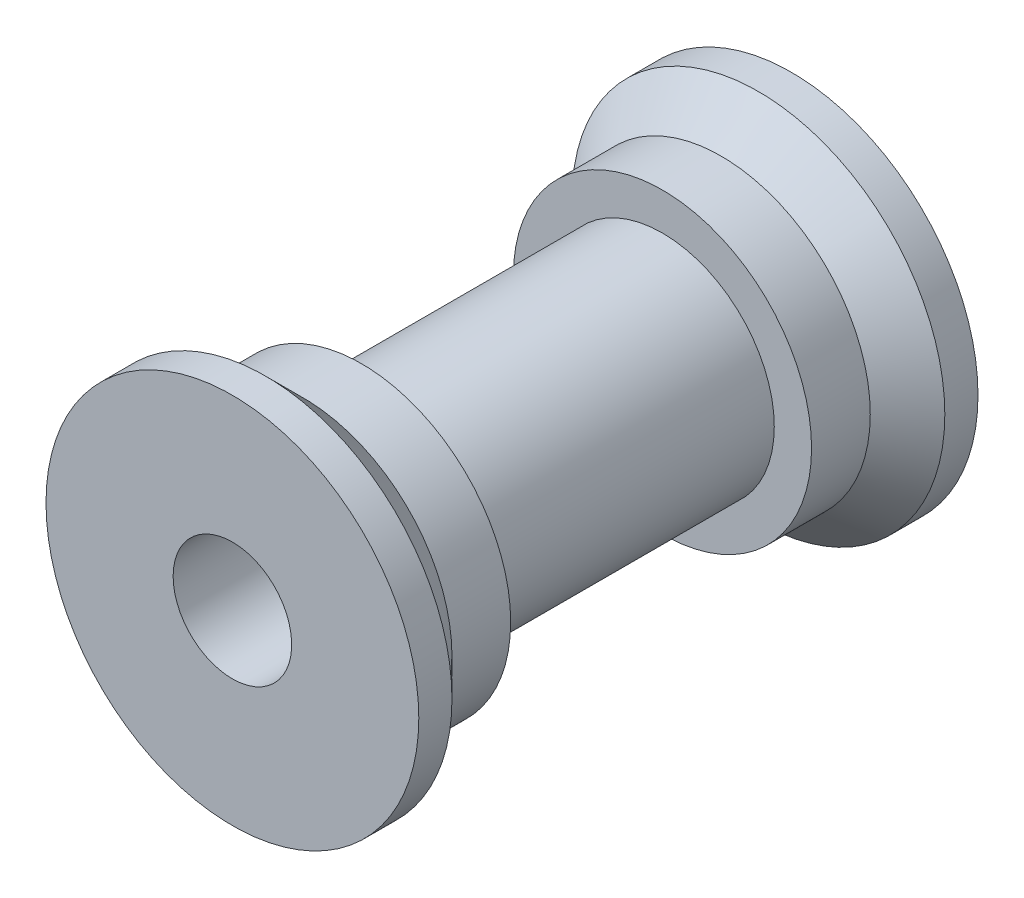
ISO-10303-21;
HEADER;
FILE_DESCRIPTION(('STEP AP214'),'2;1');
FILE_NAME('part.step','',(''),(''),'','','');
FILE_SCHEMA(('AUTOMOTIVE_DESIGN { 1 0 10303 214 1 1 1 1 }'));
ENDSEC;
DATA;
#1=APPLICATION_CONTEXT('core data for automotive mechanical design processes');
#2=APPLICATION_PROTOCOL_DEFINITION('international standard','automotive_design',2000,#1);
#3=PRODUCT_CONTEXT('',#1,'mechanical');
#4=PRODUCT('Part','Part','',(#3));
#5=PRODUCT_RELATED_PRODUCT_CATEGORY('part','',(#4));
#6=PRODUCT_DEFINITION_FORMATION('','',#4);
#7=PRODUCT_DEFINITION_CONTEXT('part definition',#1,'design');
#8=PRODUCT_DEFINITION('design','',#6,#7);
#9=PRODUCT_DEFINITION_SHAPE('','',#8);
#10=(LENGTH_UNIT() NAMED_UNIT(*) SI_UNIT(.MILLI.,.METRE.));
#11=(NAMED_UNIT(*) PLANE_ANGLE_UNIT() SI_UNIT($,.RADIAN.));
#12=(NAMED_UNIT(*) SI_UNIT($,.STERADIAN.) SOLID_ANGLE_UNIT());
#13=UNCERTAINTY_MEASURE_WITH_UNIT(LENGTH_MEASURE(1.E-05),#10,'distance_accuracy_value','');
#14=(GEOMETRIC_REPRESENTATION_CONTEXT(3) GLOBAL_UNCERTAINTY_ASSIGNED_CONTEXT((#13)) GLOBAL_UNIT_ASSIGNED_CONTEXT((#10,
#11,#12)) REPRESENTATION_CONTEXT('',''));
#15=CARTESIAN_POINT('',(0.,0.,0.));
#16=DIRECTION('',(0.,0.,1.));
#17=DIRECTION('',(1.,0.,0.));
#18=AXIS2_PLACEMENT_3D('',#15,#16,#17);
#19=CARTESIAN_POINT('',(0.,0.,38.1));
#20=DIRECTION('',(0.,0.,-1.));
#21=DIRECTION('',(-1.,0.,0.));
#22=AXIS2_PLACEMENT_3D('',#19,#20,#21);
#23=CYLINDRICAL_SURFACE('',#22,12.7);
#24=CARTESIAN_POINT('',(0.,0.,38.1));
#25=DIRECTION('',(0.,0.,1.));
#26=DIRECTION('',(1.,0.,0.));
#27=AXIS2_PLACEMENT_3D('',#24,#25,#26);
#28=CIRCLE('',#27,12.7);
#29=CARTESIAN_POINT('',(-12.7,0.,38.1));
#30=VERTEX_POINT('',#29);
#31=EDGE_CURVE('E12',#30,#30,#28,.T.);
#32=CARTESIAN_POINT('',(0.,0.,35.84));
#33=DIRECTION('',(0.,0.,-1.));
#34=DIRECTION('',(-1.,0.,0.));
#35=AXIS2_PLACEMENT_3D('',#32,#33,#34);
#36=CIRCLE('',#35,12.7);
#37=CARTESIAN_POINT('',(-12.7,0.,35.84));
#38=VERTEX_POINT('',#37);
#39=EDGE_CURVE('E58',#38,#38,#36,.T.);
#40=CARTESIAN_POINT('',(-12.7,0.,38.1));
#41=CARTESIAN_POINT('',(-12.7,0.,38.0764583333333));
#42=CARTESIAN_POINT('',(-12.7,0.,38.0529166666667));
#43=CARTESIAN_POINT('',(-12.7,0.,38.0058333333333));
#44=CARTESIAN_POINT('',(-12.7,0.,37.9822916666667));
#45=CARTESIAN_POINT('',(-12.7,0.,37.9352083333333));
#46=CARTESIAN_POINT('',(-12.7,0.,37.9116666666667));
#47=CARTESIAN_POINT('',(-12.7,0.,37.8645833333333));
#48=CARTESIAN_POINT('',(-12.7,0.,37.8410416666667));
#49=CARTESIAN_POINT('',(-12.7,0.,37.7939583333333));
#50=CARTESIAN_POINT('',(-12.7,0.,37.7704166666667));
#51=CARTESIAN_POINT('',(-12.7,0.,37.7233333333333));
#52=CARTESIAN_POINT('',(-12.7,0.,37.6997916666667));
#53=CARTESIAN_POINT('',(-12.7,0.,37.6527083333333));
#54=CARTESIAN_POINT('',(-12.7,0.,37.6291666666667));
#55=CARTESIAN_POINT('',(-12.7,0.,37.5820833333333));
#56=CARTESIAN_POINT('',(-12.7,0.,37.5585416666667));
#57=CARTESIAN_POINT('',(-12.7,0.,37.5114583333333));
#58=CARTESIAN_POINT('',(-12.7,0.,37.4879166666667));
#59=CARTESIAN_POINT('',(-12.7,0.,37.4408333333333));
#60=CARTESIAN_POINT('',(-12.7,0.,37.4172916666667));
#61=CARTESIAN_POINT('',(-12.7,0.,37.3702083333333));
#62=CARTESIAN_POINT('',(-12.7,0.,37.3466666666667));
#63=CARTESIAN_POINT('',(-12.7,0.,37.2995833333333));
#64=CARTESIAN_POINT('',(-12.7,0.,37.2760416666667));
#65=CARTESIAN_POINT('',(-12.7,0.,37.2289583333333));
#66=CARTESIAN_POINT('',(-12.7,0.,37.2054166666667));
#67=CARTESIAN_POINT('',(-12.7,0.,37.1583333333333));
#68=CARTESIAN_POINT('',(-12.7,0.,37.1347916666667));
#69=CARTESIAN_POINT('',(-12.7,0.,37.0877083333333));
#70=CARTESIAN_POINT('',(-12.7,0.,37.0641666666667));
#71=CARTESIAN_POINT('',(-12.7,0.,37.0170833333333));
#72=CARTESIAN_POINT('',(-12.7,0.,36.9935416666667));
#73=CARTESIAN_POINT('',(-12.7,0.,36.9464583333333));
#74=CARTESIAN_POINT('',(-12.7,0.,36.9229166666667));
#75=CARTESIAN_POINT('',(-12.7,0.,36.8758333333333));
#76=CARTESIAN_POINT('',(-12.7,0.,36.8522916666667));
#77=CARTESIAN_POINT('',(-12.7,0.,36.8052083333333));
#78=CARTESIAN_POINT('',(-12.7,0.,36.7816666666667));
#79=CARTESIAN_POINT('',(-12.7,0.,36.7345833333333));
#80=CARTESIAN_POINT('',(-12.7,0.,36.7110416666667));
#81=CARTESIAN_POINT('',(-12.7,0.,36.6639583333333));
#82=CARTESIAN_POINT('',(-12.7,0.,36.6404166666667));
#83=CARTESIAN_POINT('',(-12.7,0.,36.5933333333333));
#84=CARTESIAN_POINT('',(-12.7,0.,36.5697916666667));
#85=CARTESIAN_POINT('',(-12.7,0.,36.5227083333333));
#86=CARTESIAN_POINT('',(-12.7,0.,36.4991666666667));
#87=CARTESIAN_POINT('',(-12.7,0.,36.4520833333333));
#88=CARTESIAN_POINT('',(-12.7,0.,36.4285416666667));
#89=CARTESIAN_POINT('',(-12.7,0.,36.3814583333333));
#90=CARTESIAN_POINT('',(-12.7,0.,36.3579166666667));
#91=CARTESIAN_POINT('',(-12.7,0.,36.3108333333333));
#92=CARTESIAN_POINT('',(-12.7,0.,36.2872916666667));
#93=CARTESIAN_POINT('',(-12.7,0.,36.2402083333333));
#94=CARTESIAN_POINT('',(-12.7,0.,36.2166666666667));
#95=CARTESIAN_POINT('',(-12.7,0.,36.1695833333333));
#96=CARTESIAN_POINT('',(-12.7,0.,36.1460416666667));
#97=CARTESIAN_POINT('',(-12.7,0.,36.0989583333333));
#98=CARTESIAN_POINT('',(-12.7,0.,36.0754166666667));
#99=CARTESIAN_POINT('',(-12.7,0.,36.0283333333334));
#100=CARTESIAN_POINT('',(-12.7,0.,36.0047916666667));
#101=CARTESIAN_POINT('',(-12.7,0.,35.9577083333334));
#102=CARTESIAN_POINT('',(-12.7,0.,35.9341666666667));
#103=CARTESIAN_POINT('',(-12.7,0.,35.8870833333334));
#104=CARTESIAN_POINT('',(-12.7,0.,35.8635416666667));
#105=CARTESIAN_POINT('',(-12.7,0.,35.84));
#106=B_SPLINE_CURVE_WITH_KNOTS('',3,(#40,#41,#42,#43,#44,#45,#46,#47,#48,#49,#50,#51,#52,#53,
#54,#55,#56,#57,#58,#59,#60,#61,#62,#63,#64,#65,#66,#67,#68,#69,#70,#71,#72,#73,#74,#75,#76,#77,
#78,#79,#80,#81,#82,#83,#84,#85,#86,#87,#88,#89,#90,#91,#92,#93,#94,#95,#96,#97,#98,#99,#100,
#101,#102,#103,#104,#105),.UNSPECIFIED.,.F.,.F.,(4,2,2,2,2,2,2,2,2,2,2,2,2,2,2,2,2,2,2,2,2,2,2,
2,2,2,2,2,2,2,2,2,4),(0.,0.0706250000000047,0.141250000000002,0.211875,0.282499999999998,
0.353125000000003,0.423750000000001,0.494374999999998,0.564999999999996,0.635624999999994,
0.706249999999998,0.776874999999996,0.847499999999994,0.918124999999992,0.988749999999997,
1.05937499999999,1.12999999999999,1.20062499999999,1.27124999999999,1.34187499999999,
1.41249999999999,1.48312499999999,1.55374999999999,1.62437499999999,1.69499999999999,
1.76562499999999,1.83624999999998,1.90687499999998,1.97749999999999,2.04812499999998,
2.11874999999998,2.18937499999998,2.25999999999998),.UNSPECIFIED.);
#107=EDGE_CURVE('BSEAM43',#30,#38,#106,.T.);
#108=ORIENTED_EDGE('',*,*,#31,.F.);
#109=ORIENTED_EDGE('',*,*,#39,.F.);
#110=ORIENTED_EDGE('',*,*,#107,.T.);
#111=ORIENTED_EDGE('',*,*,#107,.F.);
#112=EDGE_LOOP('',(#108,#110,#109,#111));
#113=FACE_BOUND('',#112,.T.);
#114=ADVANCED_FACE('F43',(#113),#23,.T.);
#115=CARTESIAN_POINT('',(0.,0.,0.));
#116=DIRECTION('',(0.,0.,1.));
#117=DIRECTION('',(1.,0.,0.));
#118=AXIS2_PLACEMENT_3D('',#115,#116,#117);
#119=CIRCLE('',#118,12.7);
#120=CARTESIAN_POINT('',(-12.7,0.,0.));
#121=VERTEX_POINT('',#120);
#122=EDGE_CURVE('E46',#121,#121,#119,.T.);
#123=CARTESIAN_POINT('',(0.,0.,2.26000000000003));
#124=DIRECTION('',(0.,0.,-1.));
#125=DIRECTION('',(-1.,0.,0.));
#126=AXIS2_PLACEMENT_3D('',#123,#124,#125);
#127=CIRCLE('',#126,12.7);
#128=CARTESIAN_POINT('',(-12.7,0.,2.26000000000003));
#129=VERTEX_POINT('',#128);
#130=EDGE_CURVE('E81',#129,#129,#127,.T.);
#131=CARTESIAN_POINT('',(-12.7,0.,0.));
#132=CARTESIAN_POINT('',(-12.7,0.,0.0235416666666659));
#133=CARTESIAN_POINT('',(-12.7,0.,0.0470833333333319));
#134=CARTESIAN_POINT('',(-12.7,0.,0.094166666666666));
#135=CARTESIAN_POINT('',(-12.7,0.,0.117708333333334));
#136=CARTESIAN_POINT('',(-12.7,0.,0.164791666666668));
#137=CARTESIAN_POINT('',(-12.7,0.,0.188333333333334));
#138=CARTESIAN_POINT('',(-12.7,0.,0.235416666666668));
#139=CARTESIAN_POINT('',(-12.7,0.,0.258958333333337));
#140=CARTESIAN_POINT('',(-12.7,0.,0.306041666666671));
#141=CARTESIAN_POINT('',(-12.7,0.,0.329583333333337));
#142=CARTESIAN_POINT('',(-12.7,0.,0.376666666666671));
#143=CARTESIAN_POINT('',(-12.7,0.,0.400208333333339));
#144=CARTESIAN_POINT('',(-12.7,0.,0.447291666666673));
#145=CARTESIAN_POINT('',(-12.7,0.,0.470833333333339));
#146=CARTESIAN_POINT('',(-12.7,0.,0.517916666666673));
#147=CARTESIAN_POINT('',(-12.7,0.,0.541458333333342));
#148=CARTESIAN_POINT('',(-12.7,0.,0.588541666666676));
#149=CARTESIAN_POINT('',(-12.7,0.,0.612083333333342));
#150=CARTESIAN_POINT('',(-12.7,0.,0.659166666666674));
#151=CARTESIAN_POINT('',(-12.7,0.,0.68270833333334));
#152=CARTESIAN_POINT('',(-12.7,0.,0.729791666666674));
#153=CARTESIAN_POINT('',(-12.7,0.,0.753333333333342));
#154=CARTESIAN_POINT('',(-12.7,0.,0.800416666666676));
#155=CARTESIAN_POINT('',(-12.7,0.,0.823958333333342));
#156=CARTESIAN_POINT('',(-12.7,0.,0.871041666666676));
#157=CARTESIAN_POINT('',(-12.7,0.,0.894583333333344));
#158=CARTESIAN_POINT('',(-12.7,0.,0.941666666666679));
#159=CARTESIAN_POINT('',(-12.7,0.,0.965208333333345));
#160=CARTESIAN_POINT('',(-12.7,0.,1.01229166666668));
#161=CARTESIAN_POINT('',(-12.7,0.,1.03583333333335));
#162=CARTESIAN_POINT('',(-12.7,0.,1.08291666666668));
#163=CARTESIAN_POINT('',(-12.7,0.,1.10645833333335));
#164=CARTESIAN_POINT('',(-12.7,0.,1.15354166666668));
#165=CARTESIAN_POINT('',(-12.7,0.,1.17708333333334));
#166=CARTESIAN_POINT('',(-12.7,0.,1.22416666666668));
#167=CARTESIAN_POINT('',(-12.7,0.,1.24770833333335));
#168=CARTESIAN_POINT('',(-12.7,0.,1.29479166666668));
#169=CARTESIAN_POINT('',(-12.7,0.,1.31833333333335));
#170=CARTESIAN_POINT('',(-12.7,0.,1.36541666666668));
#171=CARTESIAN_POINT('',(-12.7,0.,1.38895833333335));
#172=CARTESIAN_POINT('',(-12.7,0.,1.43604166666668));
#173=CARTESIAN_POINT('',(-12.7,0.,1.45958333333335));
#174=CARTESIAN_POINT('',(-12.7,0.,1.50666666666668));
#175=CARTESIAN_POINT('',(-12.7,0.,1.53020833333335));
#176=CARTESIAN_POINT('',(-12.7,0.,1.57729166666669));
#177=CARTESIAN_POINT('',(-12.7,0.,1.60083333333335));
#178=CARTESIAN_POINT('',(-12.7,0.,1.64791666666668));
#179=CARTESIAN_POINT('',(-12.7,0.,1.67145833333335));
#180=CARTESIAN_POINT('',(-12.7,0.,1.71854166666668));
#181=CARTESIAN_POINT('',(-12.7,0.,1.74208333333335));
#182=CARTESIAN_POINT('',(-12.7,0.,1.78916666666669));
#183=CARTESIAN_POINT('',(-12.7,0.,1.81270833333335));
#184=CARTESIAN_POINT('',(-12.7,0.,1.85979166666669));
#185=CARTESIAN_POINT('',(-12.7,0.,1.88333333333335));
#186=CARTESIAN_POINT('',(-12.7,0.,1.93041666666669));
#187=CARTESIAN_POINT('',(-12.7,0.,1.95395833333335));
#188=CARTESIAN_POINT('',(-12.7,0.,2.00104166666669));
#189=CARTESIAN_POINT('',(-12.7,0.,2.02458333333336));
#190=CARTESIAN_POINT('',(-12.7,0.,2.07166666666669));
#191=CARTESIAN_POINT('',(-12.7,0.,2.09520833333336));
#192=CARTESIAN_POINT('',(-12.7,0.,2.14229166666669));
#193=CARTESIAN_POINT('',(-12.7,0.,2.16583333333336));
#194=CARTESIAN_POINT('',(-12.7,0.,2.21291666666669));
#195=CARTESIAN_POINT('',(-12.7,0.,2.23645833333336));
#196=CARTESIAN_POINT('',(-12.7,0.,2.26000000000003));
#197=B_SPLINE_CURVE_WITH_KNOTS('',3,(#131,#132,#133,#134,#135,#136,#137,#138,#139,#140,#141,
#142,#143,#144,#145,#146,#147,#148,#149,#150,#151,#152,#153,#154,#155,#156,#157,#158,#159,#160,
#161,#162,#163,#164,#165,#166,#167,#168,#169,#170,#171,#172,#173,#174,#175,#176,#177,#178,#179,
#180,#181,#182,#183,#184,#185,#186,#187,#188,#189,#190,#191,#192,#193,#194,#195,#196),
.UNSPECIFIED.,.F.,.F.,(4,2,2,2,2,2,2,2,2,2,2,2,2,2,2,2,2,2,2,2,2,2,2,2,2,2,2,2,2,2,2,2,4),(0.,
0.0706249999999978,0.141250000000002,0.211875,0.282500000000005,0.353125000000003,
0.423750000000007,0.494375000000005,0.56500000000001,0.635625000000008,0.706250000000005,
0.77687500000001,0.847500000000008,0.918125000000013,0.98875000000001,1.05937500000002,
1.13000000000001,1.20062500000001,1.27125000000002,1.34187500000001,1.41250000000002,
1.48312500000002,1.55375000000002,1.62437500000002,1.69500000000002,1.76562500000002,
1.83625000000002,1.90687500000002,1.97750000000002,2.04812500000003,2.11875000000002,
2.18937500000003,2.26000000000003),.UNSPECIFIED.);
#198=EDGE_CURVE('BSEAM85',#121,#129,#197,.T.);
#199=ORIENTED_EDGE('',*,*,#122,.T.);
#200=ORIENTED_EDGE('',*,*,#130,.T.);
#201=ORIENTED_EDGE('',*,*,#198,.T.);
#202=ORIENTED_EDGE('',*,*,#198,.F.);
#203=EDGE_LOOP('',(#199,#201,#200,#202));
#204=FACE_BOUND('',#203,.T.);
#205=ADVANCED_FACE('F85',(#204),#23,.T.);
#206=CARTESIAN_POINT('',(0.,0.,38.1));
#207=DIRECTION('',(0.,0.,1.));
#208=DIRECTION('',(1.,0.,0.));
#209=AXIS2_PLACEMENT_3D('',#206,#207,#208);
#210=PLANE('',#209);
#211=ORIENTED_EDGE('',*,*,#31,.T.);
#212=EDGE_LOOP('',(#211));
#213=FACE_BOUND('',#212,.T.);
#214=CARTESIAN_POINT('',(0.,0.,38.1));
#215=DIRECTION('',(0.,0.,1.));
#216=DIRECTION('',(1.,0.,0.));
#217=AXIS2_PLACEMENT_3D('',#214,#215,#216);
#218=CIRCLE('',#217,4.0386);
#219=CARTESIAN_POINT('',(-4.0386,0.,38.1));
#220=VERTEX_POINT('',#219);
#221=EDGE_CURVE('E53',#220,#220,#218,.T.);
#222=ORIENTED_EDGE('',*,*,#221,.F.);
#223=EDGE_LOOP('',(#222));
#224=FACE_BOUND('',#223,.T.);
#225=ADVANCED_FACE('F103',(#213,#224),#210,.T.);
#226=CARTESIAN_POINT('',(0.,0.,0.));
#227=DIRECTION('',(0.,0.,1.));
#228=DIRECTION('',(1.,0.,0.));
#229=AXIS2_PLACEMENT_3D('',#226,#227,#228);
#230=PLANE('',#229);
#231=ORIENTED_EDGE('',*,*,#122,.F.);
#232=EDGE_LOOP('',(#231));
#233=FACE_BOUND('',#232,.T.);
#234=CARTESIAN_POINT('',(0.,0.,0.));
#235=DIRECTION('',(0.,0.,1.));
#236=DIRECTION('',(1.,0.,0.));
#237=AXIS2_PLACEMENT_3D('',#234,#235,#236);
#238=CIRCLE('',#237,4.0386);
#239=CARTESIAN_POINT('',(-4.0386,0.,0.));
#240=VERTEX_POINT('',#239);
#241=EDGE_CURVE('E55',#240,#240,#238,.T.);
#242=ORIENTED_EDGE('',*,*,#241,.T.);
#243=EDGE_LOOP('',(#242));
#244=FACE_BOUND('',#243,.T.);
#245=ADVANCED_FACE('F144',(#233,#244),#230,.F.);
#246=CARTESIAN_POINT('',(0.,0.,38.1));
#247=DIRECTION('',(0.,0.,-1.));
#248=DIRECTION('',(-1.,0.,0.));
#249=AXIS2_PLACEMENT_3D('',#246,#247,#248);
#250=CYLINDRICAL_SURFACE('',#249,4.0386);
#251=CARTESIAN_POINT('',(-4.0386,0.,38.1));
#252=CARTESIAN_POINT('',(-4.0386,0.,37.703125));
#253=CARTESIAN_POINT('',(-4.0386,0.,37.30625));
#254=CARTESIAN_POINT('',(-4.0386,0.,36.5125));
#255=CARTESIAN_POINT('',(-4.0386,0.,36.115625));
#256=CARTESIAN_POINT('',(-4.0386,0.,35.321875));
#257=CARTESIAN_POINT('',(-4.0386,0.,34.925));
#258=CARTESIAN_POINT('',(-4.0386,0.,34.13125));
#259=CARTESIAN_POINT('',(-4.0386,0.,33.734375));
#260=CARTESIAN_POINT('',(-4.0386,0.,32.940625));
#261=CARTESIAN_POINT('',(-4.0386,0.,32.54375));
#262=CARTESIAN_POINT('',(-4.0386,0.,31.75));
#263=CARTESIAN_POINT('',(-4.0386,0.,31.353125));
#264=CARTESIAN_POINT('',(-4.0386,0.,30.559375));
#265=CARTESIAN_POINT('',(-4.0386,0.,30.1625));
#266=CARTESIAN_POINT('',(-4.0386,0.,29.36875));
#267=CARTESIAN_POINT('',(-4.0386,0.,28.971875));
#268=CARTESIAN_POINT('',(-4.0386,0.,28.178125));
#269=CARTESIAN_POINT('',(-4.0386,0.,27.78125));
#270=CARTESIAN_POINT('',(-4.0386,0.,26.9875));
#271=CARTESIAN_POINT('',(-4.0386,0.,26.590625));
#272=CARTESIAN_POINT('',(-4.0386,0.,25.796875));
#273=CARTESIAN_POINT('',(-4.0386,0.,25.4));
#274=CARTESIAN_POINT('',(-4.0386,0.,24.60625));
#275=CARTESIAN_POINT('',(-4.0386,0.,24.209375));
#276=CARTESIAN_POINT('',(-4.0386,0.,23.415625));
#277=CARTESIAN_POINT('',(-4.0386,0.,23.01875));
#278=CARTESIAN_POINT('',(-4.0386,0.,22.225));
#279=CARTESIAN_POINT('',(-4.0386,0.,21.828125));
#280=CARTESIAN_POINT('',(-4.0386,0.,21.034375));
#281=CARTESIAN_POINT('',(-4.0386,0.,20.6375));
#282=CARTESIAN_POINT('',(-4.0386,0.,19.84375));
#283=CARTESIAN_POINT('',(-4.0386,0.,19.446875));
#284=CARTESIAN_POINT('',(-4.0386,0.,18.653125));
#285=CARTESIAN_POINT('',(-4.0386,0.,18.25625));
#286=CARTESIAN_POINT('',(-4.0386,0.,17.4625));
#287=CARTESIAN_POINT('',(-4.0386,0.,17.065625));
#288=CARTESIAN_POINT('',(-4.0386,0.,16.271875));
#289=CARTESIAN_POINT('',(-4.0386,0.,15.875));
#290=CARTESIAN_POINT('',(-4.0386,0.,15.08125));
#291=CARTESIAN_POINT('',(-4.0386,0.,14.684375));
#292=CARTESIAN_POINT('',(-4.0386,0.,13.890625));
#293=CARTESIAN_POINT('',(-4.0386,0.,13.49375));
#294=CARTESIAN_POINT('',(-4.0386,0.,12.7));
#295=CARTESIAN_POINT('',(-4.0386,0.,12.303125));
#296=CARTESIAN_POINT('',(-4.0386,0.,11.509375));
#297=CARTESIAN_POINT('',(-4.0386,0.,11.1125));
#298=CARTESIAN_POINT('',(-4.0386,0.,10.31875));
#299=CARTESIAN_POINT('',(-4.0386,0.,9.92187499999999));
#300=CARTESIAN_POINT('',(-4.0386,0.,9.128125));
#301=CARTESIAN_POINT('',(-4.0386,0.,8.73124999999999));
#302=CARTESIAN_POINT('',(-4.0386,0.,7.93749999999999));
#303=CARTESIAN_POINT('',(-4.0386,0.,7.54062499999999));
#304=CARTESIAN_POINT('',(-4.0386,0.,6.746875));
#305=CARTESIAN_POINT('',(-4.0386,0.,6.35));
#306=CARTESIAN_POINT('',(-4.0386,0.,5.55625));
#307=CARTESIAN_POINT('',(-4.0386,0.,5.159375));
#308=CARTESIAN_POINT('',(-4.0386,0.,4.365625));
#309=CARTESIAN_POINT('',(-4.0386,0.,3.96875));
#310=CARTESIAN_POINT('',(-4.0386,0.,3.175));
#311=CARTESIAN_POINT('',(-4.0386,0.,2.778125));
#312=CARTESIAN_POINT('',(-4.0386,0.,1.984375));
#313=CARTESIAN_POINT('',(-4.0386,0.,1.5875));
#314=CARTESIAN_POINT('',(-4.0386,0.,0.79375));
#315=CARTESIAN_POINT('',(-4.0386,0.,0.396875));
#316=CARTESIAN_POINT('',(-4.0386,0.,0.));
#317=B_SPLINE_CURVE_WITH_KNOTS('',3,(#251,#252,#253,#254,#255,#256,#257,#258,#259,#260,#261,
#262,#263,#264,#265,#266,#267,#268,#269,#270,#271,#272,#273,#274,#275,#276,#277,#278,#279,#280,
#281,#282,#283,#284,#285,#286,#287,#288,#289,#290,#291,#292,#293,#294,#295,#296,#297,#298,#299,
#300,#301,#302,#303,#304,#305,#306,#307,#308,#309,#310,#311,#312,#313,#314,#315,#316),
.UNSPECIFIED.,.F.,.F.,(4,2,2,2,2,2,2,2,2,2,2,2,2,2,2,2,2,2,2,2,2,2,2,2,2,2,2,2,2,2,2,2,4),(0.,
1.190625,2.38125,3.571875,4.7625,5.953125,7.14375,8.334375,9.52500000000001,10.715625,11.90625,
13.096875,14.2875,15.478125,16.66875,17.859375,19.05,20.240625,21.43125,22.621875,23.8125,
25.003125,26.19375,27.384375,28.575,29.765625,30.95625,32.146875,33.3375,34.528125,35.71875,
36.909375,38.1),.UNSPECIFIED.);
#318=EDGE_CURVE('BSEAM112',#220,#240,#317,.T.);
#319=ORIENTED_EDGE('',*,*,#221,.T.);
#320=ORIENTED_EDGE('',*,*,#241,.F.);
#321=ORIENTED_EDGE('',*,*,#318,.T.);
#322=ORIENTED_EDGE('',*,*,#318,.F.);
#323=EDGE_LOOP('',(#319,#321,#320,#322));
#324=FACE_BOUND('',#323,.T.);
#325=ADVANCED_FACE('F112',(#324),#250,.F.);
#326=CARTESIAN_POINT('',(0.,0.,33.3));
#327=DIRECTION('',(0.,0.,1.));
#328=DIRECTION('',(1.,0.,0.));
#329=AXIS2_PLACEMENT_3D('',#326,#327,#328);
#330=CONICAL_SURFACE('',#329,10.16,0.785398163397446);
#331=ORIENTED_EDGE('',*,*,#39,.T.);
#332=EDGE_LOOP('',(#331));
#333=FACE_BOUND('',#332,.T.);
#334=CARTESIAN_POINT('',(0.,0.,33.3));
#335=DIRECTION('',(0.,0.,-1.));
#336=DIRECTION('',(-1.,0.,0.));
#337=AXIS2_PLACEMENT_3D('',#334,#335,#336);
#338=CIRCLE('',#337,10.16);
#339=CARTESIAN_POINT('',(-10.16,0.,33.3));
#340=VERTEX_POINT('',#339);
#341=EDGE_CURVE('E63',#340,#340,#338,.T.);
#342=ORIENTED_EDGE('',*,*,#341,.F.);
#343=EDGE_LOOP('',(#342));
#344=FACE_BOUND('',#343,.T.);
#345=ADVANCED_FACE('F108',(#333,#344),#330,.T.);
#346=CARTESIAN_POINT('',(0.,0.,0.));
#347=DIRECTION('',(0.,0.,-1.));
#348=DIRECTION('',(-1.,0.,0.));
#349=AXIS2_PLACEMENT_3D('',#346,#347,#348);
#350=CYLINDRICAL_SURFACE('',#349,10.16);
#351=ORIENTED_EDGE('',*,*,#341,.T.);
#352=EDGE_LOOP('',(#351));
#353=FACE_BOUND('',#352,.T.);
#354=CARTESIAN_POINT('',(0.,0.,29.3));
#355=DIRECTION('',(0.,0.,-1.));
#356=DIRECTION('',(-1.,0.,0.));
#357=AXIS2_PLACEMENT_3D('',#354,#355,#356);
#358=CIRCLE('',#357,10.16);
#359=CARTESIAN_POINT('',(-10.16,0.,29.3));
#360=VERTEX_POINT('',#359);
#361=EDGE_CURVE('E66',#360,#360,#358,.T.);
#362=ORIENTED_EDGE('',*,*,#361,.F.);
#363=EDGE_LOOP('',(#362));
#364=FACE_BOUND('',#363,.T.);
#365=ADVANCED_FACE('F111',(#353,#364),#350,.T.);
#366=CARTESIAN_POINT('',(10.16,0.,29.3));
#367=DIRECTION('',(0.,0.,-1.));
#368=DIRECTION('',(-1.,0.,0.));
#369=AXIS2_PLACEMENT_3D('',#366,#367,#368);
#370=PLANE('',#369);
#371=ORIENTED_EDGE('',*,*,#361,.T.);
#372=EDGE_LOOP('',(#371));
#373=FACE_BOUND('',#372,.T.);
#374=CARTESIAN_POINT('',(0.,0.,29.3));
#375=DIRECTION('',(0.,0.,-1.));
#376=DIRECTION('',(-1.,0.,0.));
#377=AXIS2_PLACEMENT_3D('',#374,#375,#376);
#378=CIRCLE('',#377,7.62);
#379=CARTESIAN_POINT('',(-7.62,0.,29.3));
#380=VERTEX_POINT('',#379);
#381=EDGE_CURVE('E69',#380,#380,#378,.T.);
#382=ORIENTED_EDGE('',*,*,#381,.F.);
#383=EDGE_LOOP('',(#382));
#384=FACE_BOUND('',#383,.T.);
#385=ADVANCED_FACE('F118',(#373,#384),#370,.T.);
#386=CARTESIAN_POINT('',(0.,0.,0.));
#387=DIRECTION('',(0.,0.,-1.));
#388=DIRECTION('',(-1.,0.,0.));
#389=AXIS2_PLACEMENT_3D('',#386,#387,#388);
#390=CYLINDRICAL_SURFACE('',#389,7.62);
#391=ORIENTED_EDGE('',*,*,#381,.T.);
#392=EDGE_LOOP('',(#391));
#393=FACE_BOUND('',#392,.T.);
#394=CARTESIAN_POINT('',(0.,0.,8.80000000000002));
#395=DIRECTION('',(0.,0.,-1.));
#396=DIRECTION('',(-1.,0.,0.));
#397=AXIS2_PLACEMENT_3D('',#394,#395,#396);
#398=CIRCLE('',#397,7.62);
#399=CARTESIAN_POINT('',(-7.62,0.,8.80000000000002));
#400=VERTEX_POINT('',#399);
#401=EDGE_CURVE('E72',#400,#400,#398,.T.);
#402=ORIENTED_EDGE('',*,*,#401,.F.);
#403=EDGE_LOOP('',(#402));
#404=FACE_BOUND('',#403,.T.);
#405=ADVANCED_FACE('F124',(#393,#404),#390,.T.);
#406=CARTESIAN_POINT('',(7.62,0.,8.80000000000002));
#407=DIRECTION('',(0.,0.,1.));
#408=DIRECTION('',(1.,0.,0.));
#409=AXIS2_PLACEMENT_3D('',#406,#407,#408);
#410=PLANE('',#409);
#411=ORIENTED_EDGE('',*,*,#401,.T.);
#412=EDGE_LOOP('',(#411));
#413=FACE_BOUND('',#412,.T.);
#414=CARTESIAN_POINT('',(0.,0.,8.80000000000002));
#415=DIRECTION('',(0.,0.,-1.));
#416=DIRECTION('',(-1.,0.,0.));
#417=AXIS2_PLACEMENT_3D('',#414,#415,#416);
#418=CIRCLE('',#417,10.16);
#419=CARTESIAN_POINT('',(-10.16,0.,8.80000000000002));
#420=VERTEX_POINT('',#419);
#421=EDGE_CURVE('E75',#420,#420,#418,.T.);
#422=ORIENTED_EDGE('',*,*,#421,.F.);
#423=EDGE_LOOP('',(#422));
#424=FACE_BOUND('',#423,.T.);
#425=ADVANCED_FACE('F95',(#413,#424),#410,.T.);
#426=CARTESIAN_POINT('',(0.,0.,0.));
#427=DIRECTION('',(0.,0.,-1.));
#428=DIRECTION('',(-1.,0.,0.));
#429=AXIS2_PLACEMENT_3D('',#426,#427,#428);
#430=CYLINDRICAL_SURFACE('',#429,10.16);
#431=ORIENTED_EDGE('',*,*,#421,.T.);
#432=EDGE_LOOP('',(#431));
#433=FACE_BOUND('',#432,.T.);
#434=CARTESIAN_POINT('',(0.,0.,4.80000000000001));
#435=DIRECTION('',(0.,0.,-1.));
#436=DIRECTION('',(-1.,0.,0.));
#437=AXIS2_PLACEMENT_3D('',#434,#435,#436);
#438=CIRCLE('',#437,10.16);
#439=CARTESIAN_POINT('',(-10.16,0.,4.80000000000001));
#440=VERTEX_POINT('',#439);
#441=EDGE_CURVE('E78',#440,#440,#438,.T.);
#442=ORIENTED_EDGE('',*,*,#441,.F.);
#443=EDGE_LOOP('',(#442));
#444=FACE_BOUND('',#443,.T.);
#445=ADVANCED_FACE('F89',(#433,#444),#430,.T.);
#446=CARTESIAN_POINT('',(0.,0.,2.26000000000003));
#447=DIRECTION('',(0.,0.,-1.));
#448=DIRECTION('',(-1.,0.,0.));
#449=AXIS2_PLACEMENT_3D('',#446,#447,#448);
#450=CONICAL_SURFACE('',#449,12.7,0.78539816339745);
#451=ORIENTED_EDGE('',*,*,#441,.T.);
#452=EDGE_LOOP('',(#451));
#453=FACE_BOUND('',#452,.T.);
#454=ORIENTED_EDGE('',*,*,#130,.F.);
#455=EDGE_LOOP('',(#454));
#456=FACE_BOUND('',#455,.T.);
#457=ADVANCED_FACE('F87',(#453,#456),#450,.T.);
#458=CLOSED_SHELL('',(#114,#205,#225,#245,#325,#345,#365,#385,#405,#425,#445,#457));
#459=MANIFOLD_SOLID_BREP('B2',#458);
#460=ADVANCED_BREP_SHAPE_REPRESENTATION('',(#18,#459),#14);
#461=SHAPE_DEFINITION_REPRESENTATION(#9,#460);
ENDSEC;
END-ISO-10303-21;
